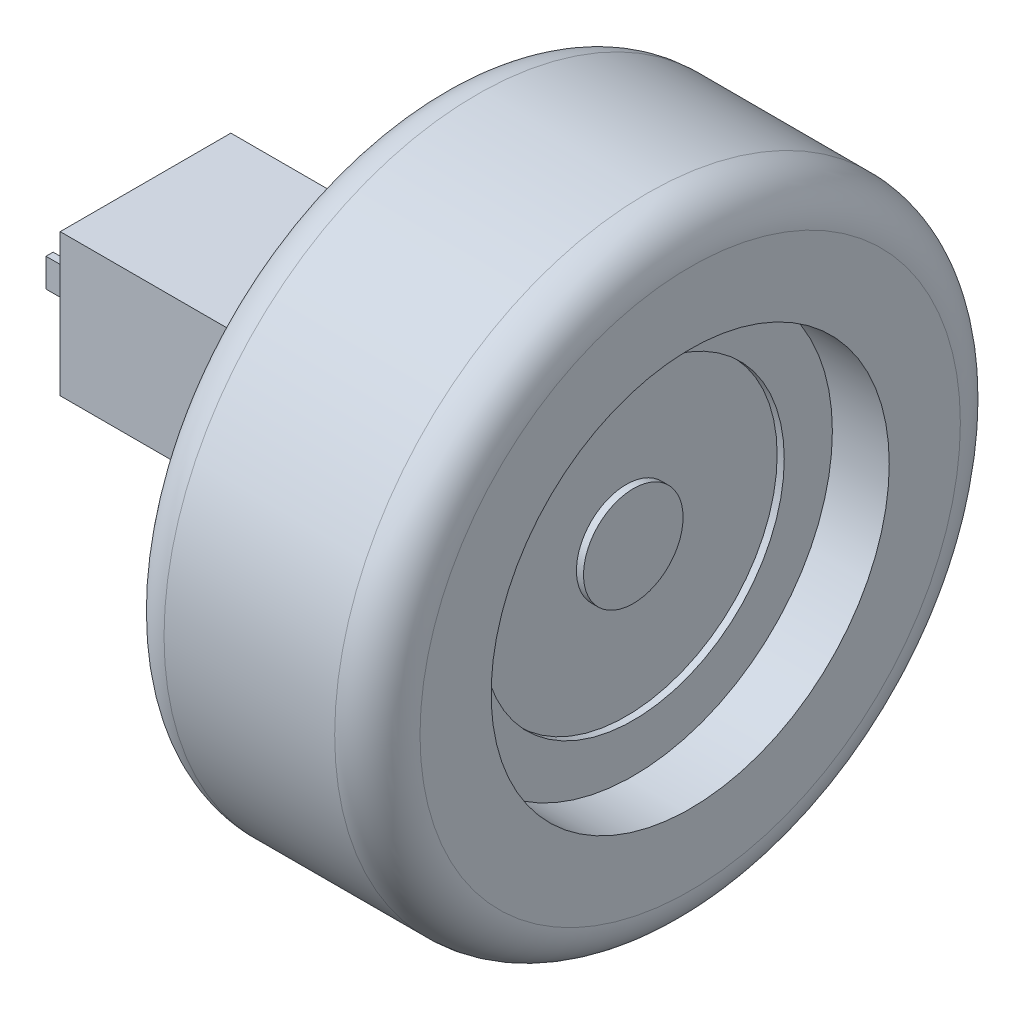
ISO-10303-21;
HEADER;
FILE_DESCRIPTION(('STEP AP214'),'2;1');
FILE_NAME('part.step','',(''),(''),'','','');
FILE_SCHEMA(('AUTOMOTIVE_DESIGN { 1 0 10303 214 1 1 1 1 }'));
ENDSEC;
DATA;
#1=APPLICATION_CONTEXT('core data for automotive mechanical design processes');
#2=APPLICATION_PROTOCOL_DEFINITION('international standard','automotive_design',2000,#1);
#3=PRODUCT_CONTEXT('',#1,'mechanical');
#4=PRODUCT('Part','Part','',(#3));
#5=PRODUCT_RELATED_PRODUCT_CATEGORY('part','',(#4));
#6=PRODUCT_DEFINITION_FORMATION('','',#4);
#7=PRODUCT_DEFINITION_CONTEXT('part definition',#1,'design');
#8=PRODUCT_DEFINITION('design','',#6,#7);
#9=PRODUCT_DEFINITION_SHAPE('','',#8);
#10=(LENGTH_UNIT() NAMED_UNIT(*) SI_UNIT(.MILLI.,.METRE.));
#11=(NAMED_UNIT(*) PLANE_ANGLE_UNIT() SI_UNIT($,.RADIAN.));
#12=(NAMED_UNIT(*) SI_UNIT($,.STERADIAN.) SOLID_ANGLE_UNIT());
#13=UNCERTAINTY_MEASURE_WITH_UNIT(LENGTH_MEASURE(1.E-05),#10,'distance_accuracy_value','');
#14=(GEOMETRIC_REPRESENTATION_CONTEXT(3) GLOBAL_UNCERTAINTY_ASSIGNED_CONTEXT((#13)) GLOBAL_UNIT_ASSIGNED_CONTEXT((#10,
#11,#12)) REPRESENTATION_CONTEXT('',''));
#15=CARTESIAN_POINT('',(0.,0.,0.));
#16=DIRECTION('',(0.,0.,1.));
#17=DIRECTION('',(1.,0.,0.));
#18=AXIS2_PLACEMENT_3D('',#15,#16,#17);
#19=CARTESIAN_POINT('',(0.,0.,0.));
#20=DIRECTION('',(1.,0.,0.));
#21=DIRECTION('',(0.,0.,-1.));
#22=AXIS2_PLACEMENT_3D('',#19,#20,#21);
#23=PLANE('',#22);
#24=DIRECTION('',(0.,1.,0.));
#25=VECTOR('',#24,1.);
#26=CARTESIAN_POINT('',(0.,1.,4.));
#27=LINE('',#26,#25);
#28=CARTESIAN_POINT('',(0.,-1.,4.));
#29=VERTEX_POINT('',#28);
#30=CARTESIAN_POINT('',(0.,1.,4.));
#31=VERTEX_POINT('',#30);
#32=EDGE_CURVE('E182',#29,#31,#27,.T.);
#33=ORIENTED_EDGE('',*,*,#32,.F.);
#34=DIRECTION('',(0.,0.,1.));
#35=VECTOR('',#34,1.);
#36=CARTESIAN_POINT('',(0.,-1.,3.5));
#37=LINE('',#36,#35);
#38=CARTESIAN_POINT('',(0.,-1.,3.5));
#39=VERTEX_POINT('',#38);
#40=EDGE_CURVE('E215',#39,#29,#37,.T.);
#41=ORIENTED_EDGE('',*,*,#40,.F.);
#42=DIRECTION('',(0.,-1.,0.));
#43=VECTOR('',#42,1.);
#44=CARTESIAN_POINT('',(0.,1.,3.5));
#45=LINE('',#44,#43);
#46=CARTESIAN_POINT('',(0.,1.,3.5));
#47=VERTEX_POINT('',#46);
#48=EDGE_CURVE('E227',#47,#39,#45,.T.);
#49=ORIENTED_EDGE('',*,*,#48,.F.);
#50=DIRECTION('',(0.,0.,-1.));
#51=VECTOR('',#50,1.);
#52=CARTESIAN_POINT('',(0.,1.,3.5));
#53=LINE('',#52,#51);
#54=EDGE_CURVE('E224',#31,#47,#53,.T.);
#55=ORIENTED_EDGE('',*,*,#54,.F.);
#56=EDGE_LOOP('',(#33,#41,#49,#55));
#57=FACE_BOUND('',#56,.T.);
#58=CARTESIAN_POINT('',(0.,0.,0.));
#59=DIRECTION('',(-1.,0.,0.));
#60=DIRECTION('',(0.,0.,1.));
#61=AXIS2_PLACEMENT_3D('',#58,#59,#60);
#62=CIRCLE('',#61,2.5);
#63=CARTESIAN_POINT('',(0.,0.,2.5));
#64=VERTEX_POINT('',#63);
#65=EDGE_CURVE('E267',#64,#64,#62,.T.);
#66=ORIENTED_EDGE('',*,*,#65,.F.);
#67=EDGE_LOOP('',(#66));
#68=FACE_BOUND('',#67,.T.);
#69=DIRECTION('',(0.,1.,0.));
#70=VECTOR('',#69,1.);
#71=CARTESIAN_POINT('',(0.,5.,-6.));
#72=LINE('',#71,#70);
#73=CARTESIAN_POINT('',(0.,-5.,-6.));
#74=VERTEX_POINT('',#73);
#75=CARTESIAN_POINT('',(0.,5.,-6.));
#76=VERTEX_POINT('',#75);
#77=EDGE_CURVE('E266',#74,#76,#72,.T.);
#78=ORIENTED_EDGE('',*,*,#77,.F.);
#79=DIRECTION('',(0.,0.,-1.));
#80=VECTOR('',#79,1.);
#81=CARTESIAN_POINT('',(0.,-5.,6.));
#82=LINE('',#81,#80);
#83=CARTESIAN_POINT('',(0.,-5.,6.));
#84=VERTEX_POINT('',#83);
#85=EDGE_CURVE('E280',#84,#74,#82,.T.);
#86=ORIENTED_EDGE('',*,*,#85,.F.);
#87=DIRECTION('',(0.,-1.,0.));
#88=VECTOR('',#87,1.);
#89=CARTESIAN_POINT('',(0.,5.,6.));
#90=LINE('',#89,#88);
#91=CARTESIAN_POINT('',(0.,5.,6.));
#92=VERTEX_POINT('',#91);
#93=EDGE_CURVE('E277',#92,#84,#90,.T.);
#94=ORIENTED_EDGE('',*,*,#93,.F.);
#95=DIRECTION('',(0.,0.,1.));
#96=VECTOR('',#95,1.);
#97=CARTESIAN_POINT('',(0.,5.,6.));
#98=LINE('',#97,#96);
#99=EDGE_CURVE('E274',#76,#92,#98,.T.);
#100=ORIENTED_EDGE('',*,*,#99,.F.);
#101=EDGE_LOOP('',(#78,#86,#94,#100));
#102=FACE_BOUND('',#101,.T.);
#103=DIRECTION('',(0.,1.,0.));
#104=VECTOR('',#103,1.);
#105=CARTESIAN_POINT('',(0.,1.,-3.5));
#106=LINE('',#105,#104);
#107=CARTESIAN_POINT('',(0.,-1.,-3.5));
#108=VERTEX_POINT('',#107);
#109=CARTESIAN_POINT('',(0.,1.,-3.5));
#110=VERTEX_POINT('',#109);
#111=EDGE_CURVE('E176',#108,#110,#106,.T.);
#112=ORIENTED_EDGE('',*,*,#111,.F.);
#113=DIRECTION('',(0.,0.,1.));
#114=VECTOR('',#113,1.);
#115=CARTESIAN_POINT('',(0.,-1.,-4.));
#116=LINE('',#115,#114);
#117=CARTESIAN_POINT('',(0.,-1.,-4.));
#118=VERTEX_POINT('',#117);
#119=EDGE_CURVE('E178',#118,#108,#116,.T.);
#120=ORIENTED_EDGE('',*,*,#119,.F.);
#121=DIRECTION('',(0.,-1.,0.));
#122=VECTOR('',#121,1.);
#123=CARTESIAN_POINT('',(0.,1.,-4.));
#124=LINE('',#123,#122);
#125=CARTESIAN_POINT('',(0.,1.,-4.));
#126=VERTEX_POINT('',#125);
#127=EDGE_CURVE('E75',#126,#118,#124,.T.);
#128=ORIENTED_EDGE('',*,*,#127,.F.);
#129=DIRECTION('',(0.,0.,-1.));
#130=VECTOR('',#129,1.);
#131=CARTESIAN_POINT('',(0.,1.,-4.));
#132=LINE('',#131,#130);
#133=EDGE_CURVE('E70',#110,#126,#132,.T.);
#134=ORIENTED_EDGE('',*,*,#133,.F.);
#135=EDGE_LOOP('',(#112,#120,#128,#134));
#136=FACE_BOUND('',#135,.T.);
#137=ADVANCED_FACE('F55',(#57,#68,#102,#136),#23,.F.);
#138=CARTESIAN_POINT('',(15.3,2.2,-3.2));
#139=DIRECTION('',(1.,0.,0.));
#140=DIRECTION('',(0.,0.,-1.));
#141=AXIS2_PLACEMENT_3D('',#138,#139,#140);
#142=CYLINDRICAL_SURFACE('',#141,2.8);
#143=CARTESIAN_POINT('',(18.3,2.2,-3.2));
#144=DIRECTION('',(-1.,0.,0.));
#145=DIRECTION('',(0.,0.,1.));
#146=AXIS2_PLACEMENT_3D('',#143,#144,#145);
#147=CIRCLE('',#146,2.8);
#148=CARTESIAN_POINT('',(18.3,5.,-3.2));
#149=VERTEX_POINT('',#148);
#150=CARTESIAN_POINT('',(18.3,2.2,-6.));
#151=VERTEX_POINT('',#150);
#152=EDGE_CURVE('E292',#149,#151,#147,.T.);
#153=ORIENTED_EDGE('',*,*,#152,.T.);
#154=EDGE_CURVE('E296',#151,#149,#147,.T.);
#155=ORIENTED_EDGE('',*,*,#154,.T.);
#156=EDGE_LOOP('',(#153,#155));
#157=FACE_BOUND('',#156,.T.);
#158=CARTESIAN_POINT('',(16.,2.2,-3.2));
#159=DIRECTION('',(-1.,0.,0.));
#160=DIRECTION('',(0.,0.,1.));
#161=AXIS2_PLACEMENT_3D('',#158,#159,#160);
#162=CIRCLE('',#161,2.8);
#163=CARTESIAN_POINT('',(16.,5.,-3.2));
#164=VERTEX_POINT('',#163);
#165=CARTESIAN_POINT('',(16.,2.2,-6.));
#166=VERTEX_POINT('',#165);
#167=EDGE_CURVE('E356',#164,#166,#162,.T.);
#168=ORIENTED_EDGE('',*,*,#167,.F.);
#169=EDGE_CURVE('E353',#166,#164,#162,.T.);
#170=ORIENTED_EDGE('',*,*,#169,.F.);
#171=EDGE_LOOP('',(#168,#170));
#172=FACE_BOUND('',#171,.T.);
#173=ADVANCED_FACE('F392',(#157,#172),#142,.T.);
#174=CARTESIAN_POINT('',(18.3,-7.,0.));
#175=DIRECTION('',(-1.,0.,0.));
#176=DIRECTION('',(0.,0.,1.));
#177=AXIS2_PLACEMENT_3D('',#174,#175,#176);
#178=PLANE('',#177);
#179=ORIENTED_EDGE('',*,*,#152,.F.);
#180=DIRECTION('',(0.,0.,1.));
#181=VECTOR('',#180,1.);
#182=CARTESIAN_POINT('',(18.3,5.,0.));
#183=LINE('',#182,#181);
#184=CARTESIAN_POINT('',(18.3,5.,-6.));
#185=VERTEX_POINT('',#184);
#186=EDGE_CURVE('E340',#185,#149,#183,.T.);
#187=ORIENTED_EDGE('',*,*,#186,.F.);
#188=DIRECTION('',(0.,1.,0.));
#189=VECTOR('',#188,1.);
#190=CARTESIAN_POINT('',(18.3,-7.,-6.));
#191=LINE('',#190,#189);
#192=EDGE_CURVE('E295',#151,#185,#191,.T.);
#193=ORIENTED_EDGE('',*,*,#192,.F.);
#194=EDGE_LOOP('',(#179,#187,#193));
#195=FACE_BOUND('',#194,.T.);
#196=ADVANCED_FACE('F400',(#195),#178,.T.);
#197=CARTESIAN_POINT('',(24.3,5.,-6.));
#198=DIRECTION('',(0.,0.,1.));
#199=DIRECTION('',(0.,-1.,0.));
#200=AXIS2_PLACEMENT_3D('',#197,#198,#199);
#201=PLANE('',#200);
#202=CARTESIAN_POINT('',(18.3,-5.,-6.));
#203=VERTEX_POINT('',#202);
#204=EDGE_CURVE('E334',#203,#151,#191,.T.);
#205=ORIENTED_EDGE('',*,*,#204,.T.);
#206=ORIENTED_EDGE('',*,*,#192,.T.);
#207=DIRECTION('',(-1.,0.,0.));
#208=VECTOR('',#207,1.);
#209=CARTESIAN_POINT('',(24.3,5.,-6.));
#210=LINE('',#209,#208);
#211=CARTESIAN_POINT('',(24.3,5.,-6.));
#212=VERTEX_POINT('',#211);
#213=EDGE_CURVE('E342',#212,#185,#210,.T.);
#214=ORIENTED_EDGE('',*,*,#213,.F.);
#215=DIRECTION('',(0.,1.,0.));
#216=VECTOR('',#215,1.);
#217=CARTESIAN_POINT('',(24.3,5.,-6.));
#218=LINE('',#217,#216);
#219=CARTESIAN_POINT('',(24.3,-5.,-6.));
#220=VERTEX_POINT('',#219);
#221=EDGE_CURVE('E313',#220,#212,#218,.T.);
#222=ORIENTED_EDGE('',*,*,#221,.F.);
#223=DIRECTION('',(-1.,0.,0.));
#224=VECTOR('',#223,1.);
#225=CARTESIAN_POINT('',(24.3,-5.,-6.));
#226=LINE('',#225,#224);
#227=EDGE_CURVE('E337',#220,#203,#226,.T.);
#228=ORIENTED_EDGE('',*,*,#227,.T.);
#229=EDGE_LOOP('',(#205,#206,#214,#222,#228));
#230=FACE_BOUND('',#229,.T.);
#231=ADVANCED_FACE('F484',(#230),#201,.F.);
#232=CARTESIAN_POINT('',(24.3,5.,6.));
#233=DIRECTION('',(0.,-1.,0.));
#234=DIRECTION('',(0.,0.,-1.));
#235=AXIS2_PLACEMENT_3D('',#232,#233,#234);
#236=PLANE('',#235);
#237=ORIENTED_EDGE('',*,*,#186,.T.);
#238=CARTESIAN_POINT('',(18.3,5.,6.));
#239=VERTEX_POINT('',#238);
#240=EDGE_CURVE('E343',#149,#239,#183,.T.);
#241=ORIENTED_EDGE('',*,*,#240,.T.);
#242=DIRECTION('',(-1.,0.,0.));
#243=VECTOR('',#242,1.);
#244=CARTESIAN_POINT('',(24.3,5.,6.));
#245=LINE('',#244,#243);
#246=CARTESIAN_POINT('',(24.3,5.,6.));
#247=VERTEX_POINT('',#246);
#248=EDGE_CURVE('E346',#247,#239,#245,.T.);
#249=ORIENTED_EDGE('',*,*,#248,.F.);
#250=DIRECTION('',(0.,0.,1.));
#251=VECTOR('',#250,1.);
#252=CARTESIAN_POINT('',(24.3,5.,6.));
#253=LINE('',#252,#251);
#254=EDGE_CURVE('E311',#212,#247,#253,.T.);
#255=ORIENTED_EDGE('',*,*,#254,.F.);
#256=ORIENTED_EDGE('',*,*,#213,.T.);
#257=EDGE_LOOP('',(#237,#241,#249,#255,#256));
#258=FACE_BOUND('',#257,.T.);
#259=ADVANCED_FACE('F480',(#258),#236,.F.);
#260=CARTESIAN_POINT('',(24.3,5.,6.));
#261=DIRECTION('',(0.,0.,-1.));
#262=DIRECTION('',(0.,1.,0.));
#263=AXIS2_PLACEMENT_3D('',#260,#261,#262);
#264=PLANE('',#263);
#265=DIRECTION('',(0.,1.,0.));
#266=VECTOR('',#265,1.);
#267=CARTESIAN_POINT('',(18.3,-7.,6.));
#268=LINE('',#267,#266);
#269=CARTESIAN_POINT('',(18.3,-5.,6.));
#270=VERTEX_POINT('',#269);
#271=EDGE_CURVE('E299',#270,#239,#268,.T.);
#272=ORIENTED_EDGE('',*,*,#271,.F.);
#273=DIRECTION('',(-1.,0.,0.));
#274=VECTOR('',#273,1.);
#275=CARTESIAN_POINT('',(24.3,-5.,6.));
#276=LINE('',#275,#274);
#277=CARTESIAN_POINT('',(24.3,-5.,6.));
#278=VERTEX_POINT('',#277);
#279=EDGE_CURVE('E320',#278,#270,#276,.T.);
#280=ORIENTED_EDGE('',*,*,#279,.F.);
#281=DIRECTION('',(0.,-1.,0.));
#282=VECTOR('',#281,1.);
#283=CARTESIAN_POINT('',(24.3,5.,6.));
#284=LINE('',#283,#282);
#285=EDGE_CURVE('E309',#247,#278,#284,.T.);
#286=ORIENTED_EDGE('',*,*,#285,.F.);
#287=ORIENTED_EDGE('',*,*,#248,.T.);
#288=EDGE_LOOP('',(#272,#280,#286,#287));
#289=FACE_BOUND('',#288,.T.);
#290=ADVANCED_FACE('F476',(#289),#264,.F.);
#291=CARTESIAN_POINT('',(24.3,-5.,6.));
#292=DIRECTION('',(0.,1.,0.));
#293=DIRECTION('',(0.,0.,1.));
#294=AXIS2_PLACEMENT_3D('',#291,#292,#293);
#295=PLANE('',#294);
#296=DIRECTION('',(0.,0.,1.));
#297=VECTOR('',#296,1.);
#298=CARTESIAN_POINT('',(18.3,-5.,6.));
#299=LINE('',#298,#297);
#300=EDGE_CURVE('E297',#203,#270,#299,.T.);
#301=ORIENTED_EDGE('',*,*,#300,.F.);
#302=ORIENTED_EDGE('',*,*,#227,.F.);
#303=DIRECTION('',(0.,0.,-1.));
#304=VECTOR('',#303,1.);
#305=CARTESIAN_POINT('',(24.3,-5.,6.));
#306=LINE('',#305,#304);
#307=EDGE_CURVE('E306',#278,#220,#306,.T.);
#308=ORIENTED_EDGE('',*,*,#307,.F.);
#309=ORIENTED_EDGE('',*,*,#279,.T.);
#310=EDGE_LOOP('',(#301,#302,#308,#309));
#311=FACE_BOUND('',#310,.T.);
#312=ADVANCED_FACE('F450',(#311),#295,.F.);
#313=CARTESIAN_POINT('',(29.3,0.,0.));
#314=DIRECTION('',(1.,0.,0.));
#315=DIRECTION('',(0.,0.,-1.));
#316=AXIS2_PLACEMENT_3D('',#313,#314,#315);
#317=PLANE('',#316);
#318=CARTESIAN_POINT('',(29.3,0.,0.));
#319=DIRECTION('',(1.,0.,0.));
#320=DIRECTION('',(0.,0.,-1.));
#321=AXIS2_PLACEMENT_3D('',#318,#319,#320);
#322=CIRCLE('',#321,1.5);
#323=CARTESIAN_POINT('',(29.3,0.,-1.5));
#324=VERTEX_POINT('',#323);
#325=EDGE_CURVE('E317',#324,#324,#322,.T.);
#326=ORIENTED_EDGE('',*,*,#325,.T.);
#327=EDGE_LOOP('',(#326));
#328=FACE_BOUND('',#327,.T.);
#329=CARTESIAN_POINT('',(29.3,0.,0.));
#330=DIRECTION('',(-1.,0.,0.));
#331=DIRECTION('',(0.,0.,1.));
#332=AXIS2_PLACEMENT_3D('',#329,#330,#331);
#333=CIRCLE('',#332,14.);
#334=CARTESIAN_POINT('',(29.3,0.,14.));
#335=VERTEX_POINT('',#334);
#336=EDGE_CURVE('E316',#335,#335,#333,.T.);
#337=ORIENTED_EDGE('',*,*,#336,.T.);
#338=EDGE_LOOP('',(#337));
#339=FACE_BOUND('',#338,.T.);
#340=ADVANCED_FACE('F429',(#328,#339),#317,.F.);
#341=CARTESIAN_POINT('',(24.3,0.,0.));
#342=DIRECTION('',(1.,0.,0.));
#343=DIRECTION('',(0.,0.,-1.));
#344=AXIS2_PLACEMENT_3D('',#341,#342,#343);
#345=PLANE('',#344);
#346=CARTESIAN_POINT('',(24.3,0.,-0.0370585687517518));
#347=DIRECTION('',(1.,0.,0.));
#348=DIRECTION('',(0.,0.,-1.));
#349=AXIS2_PLACEMENT_3D('',#346,#347,#348);
#350=CIRCLE('',#349,2.);
#351=CARTESIAN_POINT('',(24.3,0.,-2.03705856875175));
#352=VERTEX_POINT('',#351);
#353=EDGE_CURVE('E308',#352,#352,#350,.T.);
#354=ORIENTED_EDGE('',*,*,#353,.F.);
#355=EDGE_LOOP('',(#354));
#356=FACE_BOUND('',#355,.T.);
#357=ORIENTED_EDGE('',*,*,#221,.T.);
#358=ORIENTED_EDGE('',*,*,#254,.T.);
#359=ORIENTED_EDGE('',*,*,#285,.T.);
#360=ORIENTED_EDGE('',*,*,#307,.T.);
#361=EDGE_LOOP('',(#357,#358,#359,#360));
#362=FACE_BOUND('',#361,.T.);
#363=ADVANCED_FACE('F425',(#356,#362),#345,.T.);
#364=CARTESIAN_POINT('',(25.1,0.,-0.0370585687517518));
#365=DIRECTION('',(-1.,0.,0.));
#366=DIRECTION('',(0.,0.,1.));
#367=AXIS2_PLACEMENT_3D('',#364,#365,#366);
#368=CYLINDRICAL_SURFACE('',#367,2.);
#369=CARTESIAN_POINT('',(25.1,0.,-0.0370585687517518));
#370=DIRECTION('',(1.,0.,0.));
#371=DIRECTION('',(0.,0.,-1.));
#372=AXIS2_PLACEMENT_3D('',#369,#370,#371);
#373=CIRCLE('',#372,2.);
#374=CARTESIAN_POINT('',(25.1,0.,-2.03705856875175));
#375=VERTEX_POINT('',#374);
#376=EDGE_CURVE('E305',#375,#375,#373,.T.);
#377=ORIENTED_EDGE('',*,*,#376,.F.);
#378=EDGE_LOOP('',(#377));
#379=FACE_BOUND('',#378,.T.);
#380=ORIENTED_EDGE('',*,*,#353,.T.);
#381=EDGE_LOOP('',(#380));
#382=FACE_BOUND('',#381,.T.);
#383=ADVANCED_FACE('F428',(#379,#382),#368,.T.);
#384=CARTESIAN_POINT('',(25.1,0.,-0.0370585687517518));
#385=DIRECTION('',(1.,0.,0.));
#386=DIRECTION('',(0.,0.,-1.));
#387=AXIS2_PLACEMENT_3D('',#384,#385,#386);
#388=PLANE('',#387);
#389=CARTESIAN_POINT('',(25.1,0.,0.));
#390=DIRECTION('',(1.,0.,0.));
#391=DIRECTION('',(0.,0.,-1.));
#392=AXIS2_PLACEMENT_3D('',#389,#390,#391);
#393=CIRCLE('',#392,1.5);
#394=CARTESIAN_POINT('',(25.1,0.,-1.5));
#395=VERTEX_POINT('',#394);
#396=EDGE_CURVE('E301',#395,#395,#393,.T.);
#397=ORIENTED_EDGE('',*,*,#396,.F.);
#398=EDGE_LOOP('',(#397));
#399=FACE_BOUND('',#398,.T.);
#400=ORIENTED_EDGE('',*,*,#376,.T.);
#401=EDGE_LOOP('',(#400));
#402=FACE_BOUND('',#401,.T.);
#403=ADVANCED_FACE('F434',(#399,#402),#388,.T.);
#404=CARTESIAN_POINT('',(29.3,0.,0.));
#405=DIRECTION('',(-1.,0.,0.));
#406=DIRECTION('',(0.,0.,1.));
#407=AXIS2_PLACEMENT_3D('',#404,#405,#406);
#408=CYLINDRICAL_SURFACE('',#407,1.5);
#409=ORIENTED_EDGE('',*,*,#396,.T.);
#410=EDGE_LOOP('',(#409));
#411=FACE_BOUND('',#410,.T.);
#412=ORIENTED_EDGE('',*,*,#325,.F.);
#413=EDGE_LOOP('',(#412));
#414=FACE_BOUND('',#413,.T.);
#415=ADVANCED_FACE('F431',(#411,#414),#408,.T.);
#416=CARTESIAN_POINT('',(20.3,0.,0.));
#417=DIRECTION('',(-1.,0.,0.));
#418=DIRECTION('',(0.,0.,1.));
#419=AXIS2_PLACEMENT_3D('',#416,#417,#418);
#420=PLANE('',#419);
#421=CARTESIAN_POINT('',(20.3,0.,0.));
#422=DIRECTION('',(-1.,0.,0.));
#423=DIRECTION('',(0.,0.,1.));
#424=AXIS2_PLACEMENT_3D('',#421,#422,#423);
#425=CIRCLE('',#424,19.);
#426=CARTESIAN_POINT('',(20.3,0.,19.));
#427=VERTEX_POINT('',#426);
#428=EDGE_CURVE('E63',#427,#427,#425,.T.);
#429=ORIENTED_EDGE('',*,*,#428,.T.);
#430=EDGE_LOOP('',(#429));
#431=FACE_BOUND('',#430,.T.);
#432=CARTESIAN_POINT('',(20.3,0.,0.));
#433=DIRECTION('',(-1.,0.,0.));
#434=DIRECTION('',(0.,0.,1.));
#435=AXIS2_PLACEMENT_3D('',#432,#433,#434);
#436=CIRCLE('',#435,14.);
#437=CARTESIAN_POINT('',(20.3,0.,14.));
#438=VERTEX_POINT('',#437);
#439=EDGE_CURVE('E304',#438,#438,#436,.T.);
#440=ORIENTED_EDGE('',*,*,#439,.F.);
#441=EDGE_LOOP('',(#440));
#442=FACE_BOUND('',#441,.T.);
#443=ADVANCED_FACE('F374',(#431,#442),#420,.T.);
#444=CARTESIAN_POINT('',(20.3,0.,0.));
#445=DIRECTION('',(1.,0.,0.));
#446=DIRECTION('',(0.,0.,-1.));
#447=AXIS2_PLACEMENT_3D('',#444,#445,#446);
#448=CYLINDRICAL_SURFACE('',#447,14.);
#449=ORIENTED_EDGE('',*,*,#439,.T.);
#450=EDGE_LOOP('',(#449));
#451=FACE_BOUND('',#450,.T.);
#452=ORIENTED_EDGE('',*,*,#336,.F.);
#453=EDGE_LOOP('',(#452));
#454=FACE_BOUND('',#453,.T.);
#455=ADVANCED_FACE('F462',(#451,#454),#448,.F.);
#456=CARTESIAN_POINT('',(34.3,0.,0.));
#457=DIRECTION('',(1.,0.,0.));
#458=DIRECTION('',(0.,0.,-1.));
#459=AXIS2_PLACEMENT_3D('',#456,#457,#458);
#460=PLANE('',#459);
#461=CARTESIAN_POINT('',(34.3,0.,0.));
#462=DIRECTION('',(1.,0.,0.));
#463=DIRECTION('',(0.,0.,-1.));
#464=AXIS2_PLACEMENT_3D('',#461,#462,#463);
#465=CIRCLE('',#464,10.6170888770948);
#466=CARTESIAN_POINT('',(34.3,0.,-10.6170888770948));
#467=VERTEX_POINT('',#466);
#468=EDGE_CURVE('E612',#467,#467,#465,.T.);
#469=ORIENTED_EDGE('',*,*,#468,.F.);
#470=EDGE_LOOP('',(#469));
#471=FACE_BOUND('',#470,.T.);
#472=CARTESIAN_POINT('',(34.3,0.,0.));
#473=DIRECTION('',(1.,0.,0.));
#474=DIRECTION('',(0.,0.,-1.));
#475=AXIS2_PLACEMENT_3D('',#472,#473,#474);
#476=CIRCLE('',#475,14.);
#477=CARTESIAN_POINT('',(34.3,0.,-14.));
#478=VERTEX_POINT('',#477);
#479=EDGE_CURVE('E327',#478,#478,#476,.T.);
#480=ORIENTED_EDGE('',*,*,#479,.T.);
#481=EDGE_LOOP('',(#480));
#482=FACE_BOUND('',#481,.T.);
#483=ADVANCED_FACE('F458',(#471,#482),#460,.T.);
#484=CARTESIAN_POINT('',(34.3,0.,0.));
#485=DIRECTION('',(1.,0.,0.));
#486=DIRECTION('',(0.,0.,-1.));
#487=AXIS2_PLACEMENT_3D('',#484,#485,#486);
#488=CYLINDRICAL_SURFACE('',#487,14.);
#489=ORIENTED_EDGE('',*,*,#479,.F.);
#490=EDGE_LOOP('',(#489));
#491=FACE_BOUND('',#490,.T.);
#492=CARTESIAN_POINT('',(38.3,0.,0.));
#493=DIRECTION('',(1.,0.,0.));
#494=DIRECTION('',(0.,0.,-1.));
#495=AXIS2_PLACEMENT_3D('',#492,#493,#494);
#496=CIRCLE('',#495,14.);
#497=CARTESIAN_POINT('',(38.3,0.,-14.));
#498=VERTEX_POINT('',#497);
#499=EDGE_CURVE('E300',#498,#498,#496,.T.);
#500=ORIENTED_EDGE('',*,*,#499,.T.);
#501=EDGE_LOOP('',(#500));
#502=FACE_BOUND('',#501,.T.);
#503=ADVANCED_FACE('F454',(#491,#502),#488,.F.);
#504=CARTESIAN_POINT('',(38.3,0.,0.));
#505=DIRECTION('',(1.,0.,0.));
#506=DIRECTION('',(0.,0.,-1.));
#507=AXIS2_PLACEMENT_3D('',#504,#505,#506);
#508=PLANE('',#507);
#509=CARTESIAN_POINT('',(38.3,0.,0.));
#510=DIRECTION('',(1.,0.,0.));
#511=DIRECTION('',(0.,0.,-1.));
#512=AXIS2_PLACEMENT_3D('',#509,#510,#511);
#513=CIRCLE('',#512,19.);
#514=CARTESIAN_POINT('',(38.3,0.,-19.));
#515=VERTEX_POINT('',#514);
#516=EDGE_CURVE('E366',#515,#515,#513,.T.);
#517=ORIENTED_EDGE('',*,*,#516,.T.);
#518=EDGE_LOOP('',(#517));
#519=FACE_BOUND('',#518,.T.);
#520=ORIENTED_EDGE('',*,*,#499,.F.);
#521=EDGE_LOOP('',(#520));
#522=FACE_BOUND('',#521,.T.);
#523=ADVANCED_FACE('F446',(#519,#522),#508,.T.);
#524=CARTESIAN_POINT('',(38.3,0.,0.));
#525=DIRECTION('',(-1.,0.,0.));
#526=DIRECTION('',(0.,0.,1.));
#527=AXIS2_PLACEMENT_3D('',#524,#525,#526);
#528=CYLINDRICAL_SURFACE('',#527,22.);
#529=CARTESIAN_POINT('',(23.3,0.,0.));
#530=DIRECTION('',(-1.,0.,0.));
#531=DIRECTION('',(0.,0.,1.));
#532=AXIS2_PLACEMENT_3D('',#529,#530,#531);
#533=CIRCLE('',#532,22.);
#534=CARTESIAN_POINT('',(23.3,0.,22.));
#535=VERTEX_POINT('',#534);
#536=EDGE_CURVE('E12',#535,#535,#533,.F.);
#537=ORIENTED_EDGE('',*,*,#536,.T.);
#538=EDGE_LOOP('',(#537));
#539=FACE_BOUND('',#538,.T.);
#540=CARTESIAN_POINT('',(35.3,0.,0.));
#541=DIRECTION('',(1.,0.,0.));
#542=DIRECTION('',(0.,0.,-1.));
#543=AXIS2_PLACEMENT_3D('',#540,#541,#542);
#544=CIRCLE('',#543,22.);
#545=CARTESIAN_POINT('',(35.3,0.,-22.));
#546=VERTEX_POINT('',#545);
#547=EDGE_CURVE('E369',#546,#546,#544,.F.);
#548=ORIENTED_EDGE('',*,*,#547,.T.);
#549=EDGE_LOOP('',(#548));
#550=FACE_BOUND('',#549,.T.);
#551=ADVANCED_FACE('F442',(#539,#550),#528,.T.);
#552=CARTESIAN_POINT('',(18.3,-3.,-3.6));
#553=DIRECTION('',(-1.,0.,0.));
#554=DIRECTION('',(0.,0.,1.));
#555=AXIS2_PLACEMENT_3D('',#552,#553,#554);
#556=CIRCLE('',#555,1.5);
#557=CARTESIAN_POINT('',(18.3,-3.,-2.1));
#558=VERTEX_POINT('',#557);
#559=EDGE_CURVE('E243',#558,#558,#556,.T.);
#560=ORIENTED_EDGE('',*,*,#559,.F.);
#561=EDGE_LOOP('',(#560));
#562=FACE_BOUND('',#561,.T.);
#563=CARTESIAN_POINT('',(18.3,0.,0.));
#564=DIRECTION('',(-1.,0.,0.));
#565=DIRECTION('',(0.,0.,1.));
#566=AXIS2_PLACEMENT_3D('',#563,#564,#565);
#567=CIRCLE('',#566,1.);
#568=CARTESIAN_POINT('',(18.3,0.,1.));
#569=VERTEX_POINT('',#568);
#570=EDGE_CURVE('E246',#569,#569,#567,.T.);
#571=ORIENTED_EDGE('',*,*,#570,.F.);
#572=EDGE_LOOP('',(#571));
#573=FACE_BOUND('',#572,.T.);
#574=CARTESIAN_POINT('',(18.3,3.,3.6));
#575=DIRECTION('',(-1.,0.,0.));
#576=DIRECTION('',(0.,0.,1.));
#577=AXIS2_PLACEMENT_3D('',#574,#575,#576);
#578=CIRCLE('',#577,1.5);
#579=CARTESIAN_POINT('',(18.3,3.,5.1));
#580=VERTEX_POINT('',#579);
#581=EDGE_CURVE('E249',#580,#580,#578,.T.);
#582=ORIENTED_EDGE('',*,*,#581,.F.);
#583=EDGE_LOOP('',(#582));
#584=FACE_BOUND('',#583,.T.);
#585=ORIENTED_EDGE('',*,*,#154,.F.);
#586=ORIENTED_EDGE('',*,*,#204,.F.);
#587=ORIENTED_EDGE('',*,*,#300,.T.);
#588=ORIENTED_EDGE('',*,*,#271,.T.);
#589=ORIENTED_EDGE('',*,*,#240,.F.);
#590=EDGE_LOOP('',(#585,#586,#587,#588,#589));
#591=FACE_BOUND('',#590,.T.);
#592=ADVANCED_FACE('F445',(#562,#573,#584,#591),#178,.T.);
#593=CARTESIAN_POINT('',(16.,-7.,0.));
#594=DIRECTION('',(-1.,0.,0.));
#595=DIRECTION('',(0.,0.,1.));
#596=AXIS2_PLACEMENT_3D('',#593,#594,#595);
#597=PLANE('',#596);
#598=DIRECTION('',(0.,0.,1.));
#599=VECTOR('',#598,1.);
#600=CARTESIAN_POINT('',(16.,5.,0.));
#601=LINE('',#600,#599);
#602=CARTESIAN_POINT('',(16.,5.,-6.));
#603=VERTEX_POINT('',#602);
#604=EDGE_CURVE('E253',#603,#164,#601,.T.);
#605=ORIENTED_EDGE('',*,*,#604,.T.);
#606=ORIENTED_EDGE('',*,*,#167,.T.);
#607=DIRECTION('',(0.,1.,0.));
#608=VECTOR('',#607,1.);
#609=CARTESIAN_POINT('',(16.,-7.,-6.));
#610=LINE('',#609,#608);
#611=EDGE_CURVE('E256',#166,#603,#610,.T.);
#612=ORIENTED_EDGE('',*,*,#611,.T.);
#613=EDGE_LOOP('',(#605,#606,#612));
#614=FACE_BOUND('',#613,.T.);
#615=ADVANCED_FACE('F472',(#614),#597,.F.);
#616=CARTESIAN_POINT('',(-1.,0.,0.));
#617=DIRECTION('',(-1.,0.,0.));
#618=DIRECTION('',(0.,0.,1.));
#619=AXIS2_PLACEMENT_3D('',#616,#617,#618);
#620=PLANE('',#619);
#621=CARTESIAN_POINT('',(-1.,0.,0.));
#622=DIRECTION('',(-1.,0.,0.));
#623=DIRECTION('',(0.,0.,1.));
#624=AXIS2_PLACEMENT_3D('',#621,#622,#623);
#625=CIRCLE('',#624,2.5);
#626=CARTESIAN_POINT('',(-1.,0.,2.5));
#627=VERTEX_POINT('',#626);
#628=EDGE_CURVE('E260',#627,#627,#625,.T.);
#629=ORIENTED_EDGE('',*,*,#628,.T.);
#630=EDGE_LOOP('',(#629));
#631=FACE_BOUND('',#630,.T.);
#632=ADVANCED_FACE('F526',(#631),#620,.T.);
#633=CARTESIAN_POINT('',(-1.,0.,0.));
#634=DIRECTION('',(1.,0.,0.));
#635=DIRECTION('',(0.,0.,-1.));
#636=AXIS2_PLACEMENT_3D('',#633,#634,#635);
#637=CYLINDRICAL_SURFACE('',#636,2.5);
#638=ORIENTED_EDGE('',*,*,#628,.F.);
#639=EDGE_LOOP('',(#638));
#640=FACE_BOUND('',#639,.T.);
#641=ORIENTED_EDGE('',*,*,#65,.T.);
#642=EDGE_LOOP('',(#641));
#643=FACE_BOUND('',#642,.T.);
#644=ADVANCED_FACE('F406',(#640,#643),#637,.T.);
#645=CARTESIAN_POINT('',(24.3,-5.,6.));
#646=DIRECTION('',(0.,1.,0.));
#647=DIRECTION('',(0.,0.,1.));
#648=AXIS2_PLACEMENT_3D('',#645,#646,#647);
#649=PLANE('',#648);
#650=DIRECTION('',(-1.,0.,0.));
#651=VECTOR('',#650,1.);
#652=CARTESIAN_POINT('',(24.3,-5.,-6.));
#653=LINE('',#652,#651);
#654=CARTESIAN_POINT('',(16.,-5.,-6.));
#655=VERTEX_POINT('',#654);
#656=EDGE_CURVE('E283',#655,#74,#653,.T.);
#657=ORIENTED_EDGE('',*,*,#656,.F.);
#658=DIRECTION('',(0.,0.,1.));
#659=VECTOR('',#658,1.);
#660=CARTESIAN_POINT('',(16.,-5.,6.));
#661=LINE('',#660,#659);
#662=CARTESIAN_POINT('',(16.,-5.,6.));
#663=VERTEX_POINT('',#662);
#664=EDGE_CURVE('E270',#655,#663,#661,.T.);
#665=ORIENTED_EDGE('',*,*,#664,.T.);
#666=DIRECTION('',(-1.,0.,0.));
#667=VECTOR('',#666,1.);
#668=CARTESIAN_POINT('',(24.3,-5.,6.));
#669=LINE('',#668,#667);
#670=EDGE_CURVE('E285',#663,#84,#669,.T.);
#671=ORIENTED_EDGE('',*,*,#670,.T.);
#672=ORIENTED_EDGE('',*,*,#85,.T.);
#673=EDGE_LOOP('',(#657,#665,#671,#672));
#674=FACE_BOUND('',#673,.T.);
#675=ADVANCED_FACE('F408',(#674),#649,.F.);
#676=CARTESIAN_POINT('',(24.3,5.,6.));
#677=DIRECTION('',(0.,0.,-1.));
#678=DIRECTION('',(0.,1.,0.));
#679=AXIS2_PLACEMENT_3D('',#676,#677,#678);
#680=PLANE('',#679);
#681=ORIENTED_EDGE('',*,*,#670,.F.);
#682=DIRECTION('',(0.,1.,0.));
#683=VECTOR('',#682,1.);
#684=CARTESIAN_POINT('',(16.,-7.,6.));
#685=LINE('',#684,#683);
#686=CARTESIAN_POINT('',(16.,5.,6.));
#687=VERTEX_POINT('',#686);
#688=EDGE_CURVE('E257',#663,#687,#685,.T.);
#689=ORIENTED_EDGE('',*,*,#688,.T.);
#690=DIRECTION('',(-1.,0.,0.));
#691=VECTOR('',#690,1.);
#692=CARTESIAN_POINT('',(24.3,5.,6.));
#693=LINE('',#692,#691);
#694=EDGE_CURVE('E287',#687,#92,#693,.T.);
#695=ORIENTED_EDGE('',*,*,#694,.T.);
#696=ORIENTED_EDGE('',*,*,#93,.T.);
#697=EDGE_LOOP('',(#681,#689,#695,#696));
#698=FACE_BOUND('',#697,.T.);
#699=ADVANCED_FACE('F411',(#698),#680,.F.);
#700=CARTESIAN_POINT('',(24.3,5.,6.));
#701=DIRECTION('',(0.,-1.,0.));
#702=DIRECTION('',(0.,0.,-1.));
#703=AXIS2_PLACEMENT_3D('',#700,#701,#702);
#704=PLANE('',#703);
#705=EDGE_CURVE('E252',#164,#687,#601,.T.);
#706=ORIENTED_EDGE('',*,*,#705,.F.);
#707=ORIENTED_EDGE('',*,*,#604,.F.);
#708=DIRECTION('',(-1.,0.,0.));
#709=VECTOR('',#708,1.);
#710=CARTESIAN_POINT('',(24.3,5.,-6.));
#711=LINE('',#710,#709);
#712=EDGE_CURVE('E271',#603,#76,#711,.T.);
#713=ORIENTED_EDGE('',*,*,#712,.T.);
#714=ORIENTED_EDGE('',*,*,#99,.T.);
#715=ORIENTED_EDGE('',*,*,#694,.F.);
#716=EDGE_LOOP('',(#706,#707,#713,#714,#715));
#717=FACE_BOUND('',#716,.T.);
#718=ADVANCED_FACE('F415',(#717),#704,.F.);
#719=CARTESIAN_POINT('',(24.3,5.,-6.));
#720=DIRECTION('',(0.,0.,1.));
#721=DIRECTION('',(0.,-1.,0.));
#722=AXIS2_PLACEMENT_3D('',#719,#720,#721);
#723=PLANE('',#722);
#724=ORIENTED_EDGE('',*,*,#611,.F.);
#725=EDGE_CURVE('E261',#655,#166,#610,.T.);
#726=ORIENTED_EDGE('',*,*,#725,.F.);
#727=ORIENTED_EDGE('',*,*,#656,.T.);
#728=ORIENTED_EDGE('',*,*,#77,.T.);
#729=ORIENTED_EDGE('',*,*,#712,.F.);
#730=EDGE_LOOP('',(#724,#726,#727,#728,#729));
#731=FACE_BOUND('',#730,.T.);
#732=ADVANCED_FACE('F419',(#731),#723,.F.);
#733=CARTESIAN_POINT('',(16.,-3.,-3.6));
#734=DIRECTION('',(-1.,0.,0.));
#735=DIRECTION('',(0.,0.,1.));
#736=AXIS2_PLACEMENT_3D('',#733,#734,#735);
#737=CIRCLE('',#736,1.5);
#738=CARTESIAN_POINT('',(16.,-3.,-2.1));
#739=VERTEX_POINT('',#738);
#740=EDGE_CURVE('E363',#739,#739,#737,.F.);
#741=ORIENTED_EDGE('',*,*,#740,.F.);
#742=EDGE_LOOP('',(#741));
#743=FACE_BOUND('',#742,.T.);
#744=CARTESIAN_POINT('',(16.,0.,0.));
#745=DIRECTION('',(-1.,0.,0.));
#746=DIRECTION('',(0.,0.,1.));
#747=AXIS2_PLACEMENT_3D('',#744,#745,#746);
#748=CIRCLE('',#747,1.);
#749=CARTESIAN_POINT('',(16.,0.,1.));
#750=VERTEX_POINT('',#749);
#751=EDGE_CURVE('E360',#750,#750,#748,.F.);
#752=ORIENTED_EDGE('',*,*,#751,.F.);
#753=EDGE_LOOP('',(#752));
#754=FACE_BOUND('',#753,.T.);
#755=CARTESIAN_POINT('',(16.,3.,3.6));
#756=DIRECTION('',(-1.,0.,0.));
#757=DIRECTION('',(0.,0.,1.));
#758=AXIS2_PLACEMENT_3D('',#755,#756,#757);
#759=CIRCLE('',#758,1.5);
#760=CARTESIAN_POINT('',(16.,3.,5.1));
#761=VERTEX_POINT('',#760);
#762=EDGE_CURVE('E357',#761,#761,#759,.F.);
#763=ORIENTED_EDGE('',*,*,#762,.F.);
#764=EDGE_LOOP('',(#763));
#765=FACE_BOUND('',#764,.T.);
#766=ORIENTED_EDGE('',*,*,#725,.T.);
#767=ORIENTED_EDGE('',*,*,#169,.T.);
#768=ORIENTED_EDGE('',*,*,#705,.T.);
#769=ORIENTED_EDGE('',*,*,#688,.F.);
#770=ORIENTED_EDGE('',*,*,#664,.F.);
#771=EDGE_LOOP('',(#766,#767,#768,#769,#770));
#772=FACE_BOUND('',#771,.T.);
#773=ADVANCED_FACE('F422',(#743,#754,#765,#772),#597,.F.);
#774=CARTESIAN_POINT('',(15.3,3.,3.6));
#775=DIRECTION('',(1.,0.,0.));
#776=DIRECTION('',(0.,0.,-1.));
#777=AXIS2_PLACEMENT_3D('',#774,#775,#776);
#778=CYLINDRICAL_SURFACE('',#777,1.5);
#779=ORIENTED_EDGE('',*,*,#581,.T.);
#780=EDGE_LOOP('',(#779));
#781=FACE_BOUND('',#780,.T.);
#782=ORIENTED_EDGE('',*,*,#762,.T.);
#783=EDGE_LOOP('',(#782));
#784=FACE_BOUND('',#783,.T.);
#785=ADVANCED_FACE('F535',(#781,#784),#778,.T.);
#786=CARTESIAN_POINT('',(15.3,0.,0.));
#787=DIRECTION('',(1.,0.,0.));
#788=DIRECTION('',(0.,0.,-1.));
#789=AXIS2_PLACEMENT_3D('',#786,#787,#788);
#790=CYLINDRICAL_SURFACE('',#789,1.);
#791=ORIENTED_EDGE('',*,*,#570,.T.);
#792=EDGE_LOOP('',(#791));
#793=FACE_BOUND('',#792,.T.);
#794=ORIENTED_EDGE('',*,*,#751,.T.);
#795=EDGE_LOOP('',(#794));
#796=FACE_BOUND('',#795,.T.);
#797=ADVANCED_FACE('F540',(#793,#796),#790,.T.);
#798=CARTESIAN_POINT('',(15.3,-3.,-3.6));
#799=DIRECTION('',(1.,0.,0.));
#800=DIRECTION('',(0.,0.,-1.));
#801=AXIS2_PLACEMENT_3D('',#798,#799,#800);
#802=CYLINDRICAL_SURFACE('',#801,1.5);
#803=ORIENTED_EDGE('',*,*,#559,.T.);
#804=EDGE_LOOP('',(#803));
#805=FACE_BOUND('',#804,.T.);
#806=ORIENTED_EDGE('',*,*,#740,.T.);
#807=EDGE_LOOP('',(#806));
#808=FACE_BOUND('',#807,.T.);
#809=ADVANCED_FACE('F388',(#805,#808),#802,.T.);
#810=CARTESIAN_POINT('',(35.3,0.,0.));
#811=DIRECTION('',(1.,0.,0.));
#812=DIRECTION('',(0.,0.,-1.));
#813=AXIS2_PLACEMENT_3D('',#810,#811,#812);
#814=TOROIDAL_SURFACE('',#813,19.,3.);
#815=ORIENTED_EDGE('',*,*,#547,.F.);
#816=EDGE_LOOP('',(#815));
#817=FACE_BOUND('',#816,.T.);
#818=ORIENTED_EDGE('',*,*,#516,.F.);
#819=EDGE_LOOP('',(#818));
#820=FACE_BOUND('',#819,.T.);
#821=ADVANCED_FACE('F379',(#817,#820),#814,.T.);
#822=CARTESIAN_POINT('',(23.3,0.,0.));
#823=DIRECTION('',(-1.,0.,0.));
#824=DIRECTION('',(0.,0.,1.));
#825=AXIS2_PLACEMENT_3D('',#822,#823,#824);
#826=TOROIDAL_SURFACE('',#825,19.,3.);
#827=ORIENTED_EDGE('',*,*,#536,.F.);
#828=EDGE_LOOP('',(#827));
#829=FACE_BOUND('',#828,.T.);
#830=ORIENTED_EDGE('',*,*,#428,.F.);
#831=EDGE_LOOP('',(#830));
#832=FACE_BOUND('',#831,.T.);
#833=ADVANCED_FACE('F57',(#829,#832),#826,.T.);
#834=CARTESIAN_POINT('',(-3.,1.,4.));
#835=DIRECTION('',(0.,0.,-1.));
#836=DIRECTION('',(-1.,0.,0.));
#837=AXIS2_PLACEMENT_3D('',#834,#835,#836);
#838=PLANE('',#837);
#839=ORIENTED_EDGE('',*,*,#32,.T.);
#840=DIRECTION('',(1.,0.,0.));
#841=VECTOR('',#840,1.);
#842=CARTESIAN_POINT('',(-3.,1.,4.));
#843=LINE('',#842,#841);
#844=CARTESIAN_POINT('',(-3.,1.,4.));
#845=VERTEX_POINT('',#844);
#846=EDGE_CURVE('E240',#845,#31,#843,.T.);
#847=ORIENTED_EDGE('',*,*,#846,.F.);
#848=DIRECTION('',(0.,1.,0.));
#849=VECTOR('',#848,1.);
#850=CARTESIAN_POINT('',(-3.,1.,4.));
#851=LINE('',#850,#849);
#852=CARTESIAN_POINT('',(-3.,-1.,4.));
#853=VERTEX_POINT('',#852);
#854=EDGE_CURVE('E211',#853,#845,#851,.T.);
#855=ORIENTED_EDGE('',*,*,#854,.F.);
#856=DIRECTION('',(1.,0.,0.));
#857=VECTOR('',#856,1.);
#858=CARTESIAN_POINT('',(-3.,-1.,4.));
#859=LINE('',#858,#857);
#860=EDGE_CURVE('E221',#853,#29,#859,.T.);
#861=ORIENTED_EDGE('',*,*,#860,.T.);
#862=EDGE_LOOP('',(#839,#847,#855,#861));
#863=FACE_BOUND('',#862,.T.);
#864=ADVANCED_FACE('F378',(#863),#838,.F.);
#865=CARTESIAN_POINT('',(-3.,1.,3.5));
#866=DIRECTION('',(0.,-1.,0.));
#867=DIRECTION('',(0.,0.,-1.));
#868=AXIS2_PLACEMENT_3D('',#865,#866,#867);
#869=PLANE('',#868);
#870=ORIENTED_EDGE('',*,*,#54,.T.);
#871=DIRECTION('',(1.,0.,0.));
#872=VECTOR('',#871,1.);
#873=CARTESIAN_POINT('',(-3.,1.,3.5));
#874=LINE('',#873,#872);
#875=CARTESIAN_POINT('',(-3.,1.,3.5));
#876=VERTEX_POINT('',#875);
#877=EDGE_CURVE('E237',#876,#47,#874,.T.);
#878=ORIENTED_EDGE('',*,*,#877,.F.);
#879=DIRECTION('',(0.,0.,-1.));
#880=VECTOR('',#879,1.);
#881=CARTESIAN_POINT('',(-3.,1.,3.5));
#882=LINE('',#881,#880);
#883=EDGE_CURVE('E214',#845,#876,#882,.T.);
#884=ORIENTED_EDGE('',*,*,#883,.F.);
#885=ORIENTED_EDGE('',*,*,#846,.T.);
#886=EDGE_LOOP('',(#870,#878,#884,#885));
#887=FACE_BOUND('',#886,.T.);
#888=ADVANCED_FACE('F385',(#887),#869,.F.);
#889=CARTESIAN_POINT('',(-3.,1.,3.5));
#890=DIRECTION('',(0.,0.,1.));
#891=DIRECTION('',(1.,0.,0.));
#892=AXIS2_PLACEMENT_3D('',#889,#890,#891);
#893=PLANE('',#892);
#894=ORIENTED_EDGE('',*,*,#48,.T.);
#895=DIRECTION('',(1.,0.,0.));
#896=VECTOR('',#895,1.);
#897=CARTESIAN_POINT('',(-3.,-1.,3.5));
#898=LINE('',#897,#896);
#899=CARTESIAN_POINT('',(-3.,-1.,3.5));
#900=VERTEX_POINT('',#899);
#901=EDGE_CURVE('E234',#900,#39,#898,.T.);
#902=ORIENTED_EDGE('',*,*,#901,.F.);
#903=DIRECTION('',(0.,-1.,0.));
#904=VECTOR('',#903,1.);
#905=CARTESIAN_POINT('',(-3.,1.,3.5));
#906=LINE('',#905,#904);
#907=EDGE_CURVE('E217',#876,#900,#906,.T.);
#908=ORIENTED_EDGE('',*,*,#907,.F.);
#909=ORIENTED_EDGE('',*,*,#877,.T.);
#910=EDGE_LOOP('',(#894,#902,#908,#909));
#911=FACE_BOUND('',#910,.T.);
#912=ADVANCED_FACE('F560',(#911),#893,.F.);
#913=CARTESIAN_POINT('',(-3.,-1.,3.5));
#914=DIRECTION('',(0.,1.,0.));
#915=DIRECTION('',(0.,0.,1.));
#916=AXIS2_PLACEMENT_3D('',#913,#914,#915);
#917=PLANE('',#916);
#918=ORIENTED_EDGE('',*,*,#40,.T.);
#919=ORIENTED_EDGE('',*,*,#860,.F.);
#920=DIRECTION('',(0.,0.,1.));
#921=VECTOR('',#920,1.);
#922=CARTESIAN_POINT('',(-3.,-1.,3.5));
#923=LINE('',#922,#921);
#924=EDGE_CURVE('E219',#900,#853,#923,.T.);
#925=ORIENTED_EDGE('',*,*,#924,.F.);
#926=ORIENTED_EDGE('',*,*,#901,.T.);
#927=EDGE_LOOP('',(#918,#919,#925,#926));
#928=FACE_BOUND('',#927,.T.);
#929=ADVANCED_FACE('F564',(#928),#917,.F.);
#930=CARTESIAN_POINT('',(-3.,0.,0.));
#931=DIRECTION('',(-1.,0.,0.));
#932=DIRECTION('',(0.,0.,1.));
#933=AXIS2_PLACEMENT_3D('',#930,#931,#932);
#934=PLANE('',#933);
#935=ORIENTED_EDGE('',*,*,#854,.T.);
#936=ORIENTED_EDGE('',*,*,#883,.T.);
#937=ORIENTED_EDGE('',*,*,#907,.T.);
#938=ORIENTED_EDGE('',*,*,#924,.T.);
#939=EDGE_LOOP('',(#935,#936,#937,#938));
#940=FACE_BOUND('',#939,.T.);
#941=ADVANCED_FACE('F568',(#940),#934,.T.);
#942=CARTESIAN_POINT('',(-3.,1.,-3.5));
#943=DIRECTION('',(0.,0.,-1.));
#944=DIRECTION('',(0.,1.,0.));
#945=AXIS2_PLACEMENT_3D('',#942,#943,#944);
#946=PLANE('',#945);
#947=ORIENTED_EDGE('',*,*,#111,.T.);
#948=DIRECTION('',(1.,0.,0.));
#949=VECTOR('',#948,1.);
#950=CARTESIAN_POINT('',(-3.,1.,-3.5));
#951=LINE('',#950,#949);
#952=CARTESIAN_POINT('',(-3.,1.,-3.5));
#953=VERTEX_POINT('',#952);
#954=EDGE_CURVE('E618',#953,#110,#951,.T.);
#955=ORIENTED_EDGE('',*,*,#954,.F.);
#956=DIRECTION('',(0.,1.,0.));
#957=VECTOR('',#956,1.);
#958=CARTESIAN_POINT('',(-3.,1.,-3.5));
#959=LINE('',#958,#957);
#960=CARTESIAN_POINT('',(-3.,-1.,-3.5));
#961=VERTEX_POINT('',#960);
#962=EDGE_CURVE('E193',#961,#953,#959,.T.);
#963=ORIENTED_EDGE('',*,*,#962,.F.);
#964=DIRECTION('',(1.,0.,0.));
#965=VECTOR('',#964,1.);
#966=CARTESIAN_POINT('',(-3.,-1.,-3.5));
#967=LINE('',#966,#965);
#968=EDGE_CURVE('E189',#961,#108,#967,.T.);
#969=ORIENTED_EDGE('',*,*,#968,.T.);
#970=EDGE_LOOP('',(#947,#955,#963,#969));
#971=FACE_BOUND('',#970,.T.);
#972=ADVANCED_FACE('F195',(#971),#946,.F.);
#973=CARTESIAN_POINT('',(-3.,1.,-4.));
#974=DIRECTION('',(0.,-1.,0.));
#975=DIRECTION('',(0.,0.,-1.));
#976=AXIS2_PLACEMENT_3D('',#973,#974,#975);
#977=PLANE('',#976);
#978=ORIENTED_EDGE('',*,*,#133,.T.);
#979=DIRECTION('',(1.,0.,0.));
#980=VECTOR('',#979,1.);
#981=CARTESIAN_POINT('',(-3.,1.,-4.));
#982=LINE('',#981,#980);
#983=CARTESIAN_POINT('',(-3.,1.,-4.));
#984=VERTEX_POINT('',#983);
#985=EDGE_CURVE('E201',#984,#126,#982,.T.);
#986=ORIENTED_EDGE('',*,*,#985,.F.);
#987=DIRECTION('',(0.,0.,-1.));
#988=VECTOR('',#987,1.);
#989=CARTESIAN_POINT('',(-3.,1.,-4.));
#990=LINE('',#989,#988);
#991=EDGE_CURVE('E208',#953,#984,#990,.T.);
#992=ORIENTED_EDGE('',*,*,#991,.F.);
#993=ORIENTED_EDGE('',*,*,#954,.T.);
#994=EDGE_LOOP('',(#978,#986,#992,#993));
#995=FACE_BOUND('',#994,.T.);
#996=ADVANCED_FACE('F583',(#995),#977,.F.);
#997=CARTESIAN_POINT('',(-3.,1.,-4.));
#998=DIRECTION('',(0.,0.,1.));
#999=DIRECTION('',(1.,0.,0.));
#1000=AXIS2_PLACEMENT_3D('',#997,#998,#999);
#1001=PLANE('',#1000);
#1002=ORIENTED_EDGE('',*,*,#127,.T.);
#1003=DIRECTION('',(1.,0.,0.));
#1004=VECTOR('',#1003,1.);
#1005=CARTESIAN_POINT('',(-3.,-1.,-4.));
#1006=LINE('',#1005,#1004);
#1007=CARTESIAN_POINT('',(-3.,-1.,-4.));
#1008=VERTEX_POINT('',#1007);
#1009=EDGE_CURVE('E192',#1008,#118,#1006,.T.);
#1010=ORIENTED_EDGE('',*,*,#1009,.F.);
#1011=DIRECTION('',(0.,-1.,0.));
#1012=VECTOR('',#1011,1.);
#1013=CARTESIAN_POINT('',(-3.,1.,-4.));
#1014=LINE('',#1013,#1012);
#1015=EDGE_CURVE('E199',#984,#1008,#1014,.T.);
#1016=ORIENTED_EDGE('',*,*,#1015,.F.);
#1017=ORIENTED_EDGE('',*,*,#985,.T.);
#1018=EDGE_LOOP('',(#1002,#1010,#1016,#1017));
#1019=FACE_BOUND('',#1018,.T.);
#1020=ADVANCED_FACE('F580',(#1019),#1001,.F.);
#1021=CARTESIAN_POINT('',(-3.,-1.,-4.));
#1022=DIRECTION('',(0.,1.,0.));
#1023=DIRECTION('',(0.,0.,1.));
#1024=AXIS2_PLACEMENT_3D('',#1021,#1022,#1023);
#1025=PLANE('',#1024);
#1026=ORIENTED_EDGE('',*,*,#119,.T.);
#1027=ORIENTED_EDGE('',*,*,#968,.F.);
#1028=DIRECTION('',(0.,0.,1.));
#1029=VECTOR('',#1028,1.);
#1030=CARTESIAN_POINT('',(-3.,-1.,-4.));
#1031=LINE('',#1030,#1029);
#1032=EDGE_CURVE('E197',#1008,#961,#1031,.T.);
#1033=ORIENTED_EDGE('',*,*,#1032,.F.);
#1034=ORIENTED_EDGE('',*,*,#1009,.T.);
#1035=EDGE_LOOP('',(#1026,#1027,#1033,#1034));
#1036=FACE_BOUND('',#1035,.T.);
#1037=ADVANCED_FACE('F187',(#1036),#1025,.F.);
#1038=CARTESIAN_POINT('',(-3.,0.,0.));
#1039=DIRECTION('',(-1.,0.,0.));
#1040=DIRECTION('',(0.,0.,1.));
#1041=AXIS2_PLACEMENT_3D('',#1038,#1039,#1040);
#1042=PLANE('',#1041);
#1043=ORIENTED_EDGE('',*,*,#962,.T.);
#1044=ORIENTED_EDGE('',*,*,#991,.T.);
#1045=ORIENTED_EDGE('',*,*,#1015,.T.);
#1046=ORIENTED_EDGE('',*,*,#1032,.T.);
#1047=EDGE_LOOP('',(#1043,#1044,#1045,#1046));
#1048=FACE_BOUND('',#1047,.T.);
#1049=ADVANCED_FACE('F573',(#1048),#1042,.T.);
#1050=CARTESIAN_POINT('',(33.8,0.,0.));
#1051=DIRECTION('',(1.,0.,0.));
#1052=DIRECTION('',(0.,0.,-1.));
#1053=AXIS2_PLACEMENT_3D('',#1050,#1051,#1052);
#1054=CYLINDRICAL_SURFACE('',#1053,10.6170888770948);
#1055=CARTESIAN_POINT('',(33.8,0.,0.));
#1056=DIRECTION('',(1.,0.,0.));
#1057=DIRECTION('',(0.,0.,-1.));
#1058=AXIS2_PLACEMENT_3D('',#1055,#1056,#1057);
#1059=CIRCLE('',#1058,10.6170888770948);
#1060=CARTESIAN_POINT('',(33.8,0.,-10.6170888770948));
#1061=VERTEX_POINT('',#1060);
#1062=EDGE_CURVE('E615',#1061,#1061,#1059,.T.);
#1063=ORIENTED_EDGE('',*,*,#1062,.F.);
#1064=EDGE_LOOP('',(#1063));
#1065=FACE_BOUND('',#1064,.T.);
#1066=ORIENTED_EDGE('',*,*,#468,.T.);
#1067=EDGE_LOOP('',(#1066));
#1068=FACE_BOUND('',#1067,.T.);
#1069=ADVANCED_FACE('F576',(#1065,#1068),#1054,.F.);
#1070=CARTESIAN_POINT('',(33.8,0.,0.));
#1071=DIRECTION('',(1.,0.,0.));
#1072=DIRECTION('',(0.,0.,-1.));
#1073=AXIS2_PLACEMENT_3D('',#1070,#1071,#1072);
#1074=PLANE('',#1073);
#1075=CARTESIAN_POINT('',(33.8,0.,0.));
#1076=DIRECTION('',(1.,0.,0.));
#1077=DIRECTION('',(0.,0.,-1.));
#1078=AXIS2_PLACEMENT_3D('',#1075,#1076,#1077);
#1079=CIRCLE('',#1078,3.5);
#1080=CARTESIAN_POINT('',(33.8,0.,-3.5));
#1081=VERTEX_POINT('',#1080);
#1082=EDGE_CURVE('E607',#1081,#1081,#1079,.T.);
#1083=ORIENTED_EDGE('',*,*,#1082,.F.);
#1084=EDGE_LOOP('',(#1083));
#1085=FACE_BOUND('',#1084,.T.);
#1086=ORIENTED_EDGE('',*,*,#1062,.T.);
#1087=EDGE_LOOP('',(#1086));
#1088=FACE_BOUND('',#1087,.T.);
#1089=ADVANCED_FACE('F592',(#1085,#1088),#1074,.T.);
#1090=CARTESIAN_POINT('',(33.8,0.,0.));
#1091=DIRECTION('',(1.,0.,0.));
#1092=DIRECTION('',(0.,0.,-1.));
#1093=AXIS2_PLACEMENT_3D('',#1090,#1091,#1092);
#1094=CYLINDRICAL_SURFACE('',#1093,3.5);
#1095=ORIENTED_EDGE('',*,*,#1082,.T.);
#1096=EDGE_LOOP('',(#1095));
#1097=FACE_BOUND('',#1096,.T.);
#1098=CARTESIAN_POINT('',(34.3,0.,0.));
#1099=DIRECTION('',(1.,0.,0.));
#1100=DIRECTION('',(0.,0.,-1.));
#1101=AXIS2_PLACEMENT_3D('',#1098,#1099,#1100);
#1102=CIRCLE('',#1101,3.5);
#1103=CARTESIAN_POINT('',(34.3,0.,-3.5));
#1104=VERTEX_POINT('',#1103);
#1105=EDGE_CURVE('E610',#1104,#1104,#1102,.T.);
#1106=ORIENTED_EDGE('',*,*,#1105,.F.);
#1107=EDGE_LOOP('',(#1106));
#1108=FACE_BOUND('',#1107,.T.);
#1109=ADVANCED_FACE('F596',(#1097,#1108),#1094,.T.);
#1110=ORIENTED_EDGE('',*,*,#1105,.T.);
#1111=EDGE_LOOP('',(#1110));
#1112=FACE_BOUND('',#1111,.T.);
#1113=ADVANCED_FACE('F464',(#1112),#460,.T.);
#1114=CLOSED_SHELL('',(#137,#173,#196,#231,#259,#290,#312,#340,#363,#383,#403,#415,#443,#455,
#483,#503,#523,#551,#592,#615,#632,#644,#675,#699,#718,#732,#773,#785,#797,#809,#821,#833,#864,
#888,#912,#929,#941,#972,#996,#1020,#1037,#1049,#1069,#1089,#1109,#1113));
#1115=MANIFOLD_SOLID_BREP('B2',#1114);
#1116=ADVANCED_BREP_SHAPE_REPRESENTATION('',(#18,#1115),#14);
#1117=SHAPE_DEFINITION_REPRESENTATION(#9,#1116);
ENDSEC;
END-ISO-10303-21;
